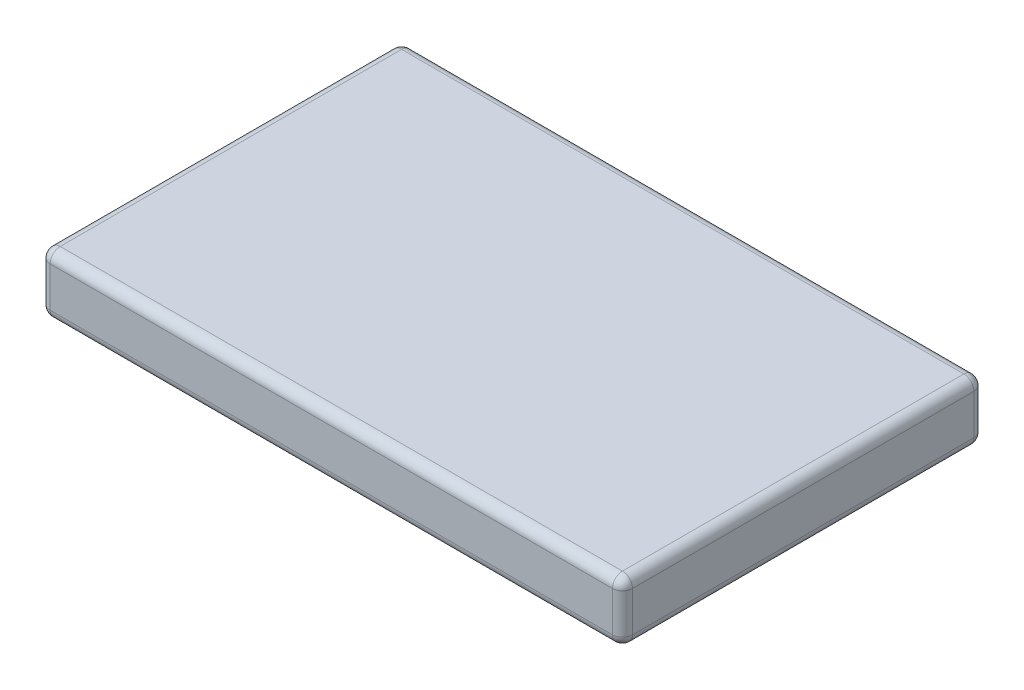
ISO-10303-21;
HEADER;
FILE_DESCRIPTION(('STEP AP214'),'2;1');
FILE_NAME('part.step','',(''),(''),'','','');
FILE_SCHEMA(('AUTOMOTIVE_DESIGN { 1 0 10303 214 1 1 1 1 }'));
ENDSEC;
DATA;
#1=APPLICATION_CONTEXT('core data for automotive mechanical design processes');
#2=APPLICATION_PROTOCOL_DEFINITION('international standard','automotive_design',2000,#1);
#3=PRODUCT_CONTEXT('',#1,'mechanical');
#4=PRODUCT('Part','Part','',(#3));
#5=PRODUCT_RELATED_PRODUCT_CATEGORY('part','',(#4));
#6=PRODUCT_DEFINITION_FORMATION('','',#4);
#7=PRODUCT_DEFINITION_CONTEXT('part definition',#1,'design');
#8=PRODUCT_DEFINITION('design','',#6,#7);
#9=PRODUCT_DEFINITION_SHAPE('','',#8);
#10=(LENGTH_UNIT() NAMED_UNIT(*) SI_UNIT(.MILLI.,.METRE.));
#11=(NAMED_UNIT(*) PLANE_ANGLE_UNIT() SI_UNIT($,.RADIAN.));
#12=(NAMED_UNIT(*) SI_UNIT($,.STERADIAN.) SOLID_ANGLE_UNIT());
#13=UNCERTAINTY_MEASURE_WITH_UNIT(LENGTH_MEASURE(1.E-05),#10,'distance_accuracy_value','');
#14=(GEOMETRIC_REPRESENTATION_CONTEXT(3) GLOBAL_UNCERTAINTY_ASSIGNED_CONTEXT((#13)) GLOBAL_UNIT_ASSIGNED_CONTEXT((#10,
#11,#12)) REPRESENTATION_CONTEXT('',''));
#15=CARTESIAN_POINT('',(0.,0.,0.));
#16=DIRECTION('',(0.,0.,1.));
#17=DIRECTION('',(1.,0.,0.));
#18=AXIS2_PLACEMENT_3D('',#15,#16,#17);
#19=CARTESIAN_POINT('',(-29.,6.,-18.));
#20=DIRECTION('',(1.,0.,0.));
#21=DIRECTION('',(0.,0.,-1.));
#22=AXIS2_PLACEMENT_3D('',#19,#20,#21);
#23=PLANE('',#22);
#24=DIRECTION('',(0.,0.,1.));
#25=VECTOR('',#24,1.);
#26=CARTESIAN_POINT('',(-29.,5.,-18.));
#27=LINE('',#26,#25);
#28=CARTESIAN_POINT('',(-29.,5.,17.));
#29=VERTEX_POINT('',#28);
#30=CARTESIAN_POINT('',(-29.,5.,-17.));
#31=VERTEX_POINT('',#30);
#32=EDGE_CURVE('E191',#29,#31,#27,.F.);
#33=ORIENTED_EDGE('',*,*,#32,.T.);
#34=DIRECTION('',(0.,-1.,0.));
#35=VECTOR('',#34,1.);
#36=CARTESIAN_POINT('',(-29.,6.,-17.));
#37=LINE('',#36,#35);
#38=CARTESIAN_POINT('',(-29.,1.,-17.));
#39=VERTEX_POINT('',#38);
#40=EDGE_CURVE('E196',#31,#39,#37,.T.);
#41=ORIENTED_EDGE('',*,*,#40,.T.);
#42=DIRECTION('',(0.,0.,1.));
#43=VECTOR('',#42,1.);
#44=CARTESIAN_POINT('',(-29.,1.,18.));
#45=LINE('',#44,#43);
#46=CARTESIAN_POINT('',(-29.,1.,17.));
#47=VERTEX_POINT('',#46);
#48=EDGE_CURVE('E193',#39,#47,#45,.T.);
#49=ORIENTED_EDGE('',*,*,#48,.T.);
#50=DIRECTION('',(0.,-1.,0.));
#51=VECTOR('',#50,1.);
#52=CARTESIAN_POINT('',(-29.,6.,17.));
#53=LINE('',#52,#51);
#54=EDGE_CURVE('E189',#47,#29,#53,.F.);
#55=ORIENTED_EDGE('',*,*,#54,.T.);
#56=EDGE_LOOP('',(#33,#41,#49,#55));
#57=FACE_BOUND('',#56,.T.);
#58=ADVANCED_FACE('F37',(#57),#23,.F.);
#59=CARTESIAN_POINT('',(29.,6.,18.));
#60=DIRECTION('',(0.,0.,-1.));
#61=DIRECTION('',(-1.,0.,0.));
#62=AXIS2_PLACEMENT_3D('',#59,#60,#61);
#63=PLANE('',#62);
#64=DIRECTION('',(1.,0.,0.));
#65=VECTOR('',#64,1.);
#66=CARTESIAN_POINT('',(29.,5.,18.));
#67=LINE('',#66,#65);
#68=CARTESIAN_POINT('',(28.,5.,18.));
#69=VERTEX_POINT('',#68);
#70=CARTESIAN_POINT('',(-28.,5.,18.));
#71=VERTEX_POINT('',#70);
#72=EDGE_CURVE('E154',#69,#71,#67,.F.);
#73=ORIENTED_EDGE('',*,*,#72,.T.);
#74=DIRECTION('',(0.,-1.,0.));
#75=VECTOR('',#74,1.);
#76=CARTESIAN_POINT('',(-28.,6.,18.));
#77=LINE('',#76,#75);
#78=CARTESIAN_POINT('',(-28.,1.,18.));
#79=VERTEX_POINT('',#78);
#80=EDGE_CURVE('E158',#71,#79,#77,.T.);
#81=ORIENTED_EDGE('',*,*,#80,.T.);
#82=DIRECTION('',(1.,0.,0.));
#83=VECTOR('',#82,1.);
#84=CARTESIAN_POINT('',(29.,1.,18.));
#85=LINE('',#84,#83);
#86=CARTESIAN_POINT('',(28.,1.,18.));
#87=VERTEX_POINT('',#86);
#88=EDGE_CURVE('E130',#79,#87,#85,.T.);
#89=ORIENTED_EDGE('',*,*,#88,.T.);
#90=DIRECTION('',(0.,-1.,0.));
#91=VECTOR('',#90,1.);
#92=CARTESIAN_POINT('',(28.,6.,18.));
#93=LINE('',#92,#91);
#94=EDGE_CURVE('E148',#87,#69,#93,.F.);
#95=ORIENTED_EDGE('',*,*,#94,.T.);
#96=EDGE_LOOP('',(#73,#81,#89,#95));
#97=FACE_BOUND('',#96,.T.);
#98=ADVANCED_FACE('F156',(#97),#63,.F.);
#99=CARTESIAN_POINT('',(29.,6.,-18.));
#100=DIRECTION('',(-1.,0.,0.));
#101=DIRECTION('',(0.,0.,1.));
#102=AXIS2_PLACEMENT_3D('',#99,#100,#101);
#103=PLANE('',#102);
#104=DIRECTION('',(0.,0.,-1.));
#105=VECTOR('',#104,1.);
#106=CARTESIAN_POINT('',(29.,1.,-18.));
#107=LINE('',#106,#105);
#108=CARTESIAN_POINT('',(29.,1.,17.));
#109=VERTEX_POINT('',#108);
#110=CARTESIAN_POINT('',(29.,1.,-17.));
#111=VERTEX_POINT('',#110);
#112=EDGE_CURVE('E175',#109,#111,#107,.T.);
#113=ORIENTED_EDGE('',*,*,#112,.T.);
#114=DIRECTION('',(0.,-1.,0.));
#115=VECTOR('',#114,1.);
#116=CARTESIAN_POINT('',(29.,6.,-17.));
#117=LINE('',#116,#115);
#118=CARTESIAN_POINT('',(29.,5.,-17.));
#119=VERTEX_POINT('',#118);
#120=EDGE_CURVE('E178',#111,#119,#117,.F.);
#121=ORIENTED_EDGE('',*,*,#120,.T.);
#122=DIRECTION('',(0.,0.,-1.));
#123=VECTOR('',#122,1.);
#124=CARTESIAN_POINT('',(29.,5.,-18.));
#125=LINE('',#124,#123);
#126=CARTESIAN_POINT('',(29.,5.,17.));
#127=VERTEX_POINT('',#126);
#128=EDGE_CURVE('E173',#119,#127,#125,.F.);
#129=ORIENTED_EDGE('',*,*,#128,.T.);
#130=DIRECTION('',(0.,-1.,0.));
#131=VECTOR('',#130,1.);
#132=CARTESIAN_POINT('',(29.,6.,17.));
#133=LINE('',#132,#131);
#134=EDGE_CURVE('E171',#127,#109,#133,.T.);
#135=ORIENTED_EDGE('',*,*,#134,.T.);
#136=EDGE_LOOP('',(#113,#121,#129,#135));
#137=FACE_BOUND('',#136,.T.);
#138=ADVANCED_FACE('F331',(#137),#103,.F.);
#139=CARTESIAN_POINT('',(29.,6.,-18.));
#140=DIRECTION('',(0.,0.,1.));
#141=DIRECTION('',(1.,0.,0.));
#142=AXIS2_PLACEMENT_3D('',#139,#140,#141);
#143=PLANE('',#142);
#144=DIRECTION('',(-1.,0.,0.));
#145=VECTOR('',#144,1.);
#146=CARTESIAN_POINT('',(-29.,1.,-18.));
#147=LINE('',#146,#145);
#148=CARTESIAN_POINT('',(28.,1.,-18.));
#149=VERTEX_POINT('',#148);
#150=CARTESIAN_POINT('',(-28.,1.,-18.));
#151=VERTEX_POINT('',#150);
#152=EDGE_CURVE('E184',#149,#151,#147,.T.);
#153=ORIENTED_EDGE('',*,*,#152,.T.);
#154=DIRECTION('',(0.,-1.,0.));
#155=VECTOR('',#154,1.);
#156=CARTESIAN_POINT('',(-28.,6.,-18.));
#157=LINE('',#156,#155);
#158=CARTESIAN_POINT('',(-28.,5.,-18.));
#159=VERTEX_POINT('',#158);
#160=EDGE_CURVE('E187',#151,#159,#157,.F.);
#161=ORIENTED_EDGE('',*,*,#160,.T.);
#162=DIRECTION('',(-1.,0.,0.));
#163=VECTOR('',#162,1.);
#164=CARTESIAN_POINT('',(29.,5.,-18.));
#165=LINE('',#164,#163);
#166=CARTESIAN_POINT('',(28.,5.,-18.));
#167=VERTEX_POINT('',#166);
#168=EDGE_CURVE('E182',#159,#167,#165,.F.);
#169=ORIENTED_EDGE('',*,*,#168,.T.);
#170=DIRECTION('',(0.,-1.,0.));
#171=VECTOR('',#170,1.);
#172=CARTESIAN_POINT('',(28.,6.,-18.));
#173=LINE('',#172,#171);
#174=EDGE_CURVE('E180',#167,#149,#173,.T.);
#175=ORIENTED_EDGE('',*,*,#174,.T.);
#176=EDGE_LOOP('',(#153,#161,#169,#175));
#177=FACE_BOUND('',#176,.T.);
#178=ADVANCED_FACE('F298',(#177),#143,.F.);
#179=CARTESIAN_POINT('',(0.,6.,0.));
#180=DIRECTION('',(0.,-1.,0.));
#181=DIRECTION('',(0.,0.,-1.));
#182=AXIS2_PLACEMENT_3D('',#179,#180,#181);
#183=PLANE('',#182);
#184=DIRECTION('',(0.,0.,-1.));
#185=VECTOR('',#184,1.);
#186=CARTESIAN_POINT('',(28.,6.,0.));
#187=LINE('',#186,#185);
#188=CARTESIAN_POINT('',(28.,6.,17.));
#189=VERTEX_POINT('',#188);
#190=CARTESIAN_POINT('',(28.,6.,-17.));
#191=VERTEX_POINT('',#190);
#192=EDGE_CURVE('E46',#189,#191,#187,.T.);
#193=ORIENTED_EDGE('',*,*,#192,.T.);
#194=DIRECTION('',(-1.,0.,0.));
#195=VECTOR('',#194,1.);
#196=CARTESIAN_POINT('',(0.,6.,-17.));
#197=LINE('',#196,#195);
#198=CARTESIAN_POINT('',(-28.,6.,-17.));
#199=VERTEX_POINT('',#198);
#200=EDGE_CURVE('E11',#191,#199,#197,.T.);
#201=ORIENTED_EDGE('',*,*,#200,.T.);
#202=DIRECTION('',(0.,0.,1.));
#203=VECTOR('',#202,1.);
#204=CARTESIAN_POINT('',(-28.,6.,0.));
#205=LINE('',#204,#203);
#206=CARTESIAN_POINT('',(-28.,6.,17.));
#207=VERTEX_POINT('',#206);
#208=EDGE_CURVE('E198',#199,#207,#205,.T.);
#209=ORIENTED_EDGE('',*,*,#208,.T.);
#210=DIRECTION('',(1.,0.,0.));
#211=VECTOR('',#210,1.);
#212=CARTESIAN_POINT('',(0.,6.,17.));
#213=LINE('',#212,#211);
#214=EDGE_CURVE('E57',#207,#189,#213,.T.);
#215=ORIENTED_EDGE('',*,*,#214,.T.);
#216=EDGE_LOOP('',(#193,#201,#209,#215));
#217=FACE_BOUND('',#216,.T.);
#218=ADVANCED_FACE('F278',(#217),#183,.F.);
#219=CARTESIAN_POINT('',(0.,0.,0.));
#220=DIRECTION('',(0.,-1.,0.));
#221=DIRECTION('',(0.,0.,-1.));
#222=AXIS2_PLACEMENT_3D('',#219,#220,#221);
#223=PLANE('',#222);
#224=DIRECTION('',(0.,0.,-1.));
#225=VECTOR('',#224,1.);
#226=CARTESIAN_POINT('',(28.,0.,18.));
#227=LINE('',#226,#225);
#228=CARTESIAN_POINT('',(28.,0.,-17.));
#229=VERTEX_POINT('',#228);
#230=CARTESIAN_POINT('',(28.,0.,17.));
#231=VERTEX_POINT('',#230);
#232=EDGE_CURVE('E168',#229,#231,#227,.F.);
#233=ORIENTED_EDGE('',*,*,#232,.T.);
#234=DIRECTION('',(1.,0.,0.));
#235=VECTOR('',#234,1.);
#236=CARTESIAN_POINT('',(-29.,0.,17.));
#237=LINE('',#236,#235);
#238=CARTESIAN_POINT('',(-28.,0.,17.));
#239=VERTEX_POINT('',#238);
#240=EDGE_CURVE('E132',#231,#239,#237,.F.);
#241=ORIENTED_EDGE('',*,*,#240,.T.);
#242=DIRECTION('',(0.,0.,1.));
#243=VECTOR('',#242,1.);
#244=CARTESIAN_POINT('',(-28.,0.,-18.));
#245=LINE('',#244,#243);
#246=CARTESIAN_POINT('',(-28.,0.,-17.));
#247=VERTEX_POINT('',#246);
#248=EDGE_CURVE('E161',#239,#247,#245,.F.);
#249=ORIENTED_EDGE('',*,*,#248,.T.);
#250=DIRECTION('',(-1.,0.,0.));
#251=VECTOR('',#250,1.);
#252=CARTESIAN_POINT('',(29.,0.,-17.));
#253=LINE('',#252,#251);
#254=EDGE_CURVE('E166',#247,#229,#253,.F.);
#255=ORIENTED_EDGE('',*,*,#254,.T.);
#256=EDGE_LOOP('',(#233,#241,#249,#255));
#257=FACE_BOUND('',#256,.T.);
#258=ADVANCED_FACE('F359',(#257),#223,.T.);
#259=CARTESIAN_POINT('',(0.,5.,-17.));
#260=DIRECTION('',(-1.,0.,0.));
#261=DIRECTION('',(0.,0.,1.));
#262=AXIS2_PLACEMENT_3D('',#259,#260,#261);
#263=CYLINDRICAL_SURFACE('',#262,1.);
#264=CARTESIAN_POINT('',(-28.,5.,-17.));
#265=DIRECTION('',(-1.,0.,0.));
#266=DIRECTION('',(0.,0.,1.));
#267=AXIS2_PLACEMENT_3D('',#264,#265,#266);
#268=CIRCLE('',#267,1.);
#269=EDGE_CURVE('E41',#199,#159,#268,.T.);
#270=ORIENTED_EDGE('',*,*,#269,.F.);
#271=ORIENTED_EDGE('',*,*,#200,.F.);
#272=CARTESIAN_POINT('',(28.,5.,-17.));
#273=DIRECTION('',(1.,0.,0.));
#274=DIRECTION('',(0.,0.,-1.));
#275=AXIS2_PLACEMENT_3D('',#272,#273,#274);
#276=CIRCLE('',#275,1.);
#277=EDGE_CURVE('E251',#167,#191,#276,.T.);
#278=ORIENTED_EDGE('',*,*,#277,.F.);
#279=ORIENTED_EDGE('',*,*,#168,.F.);
#280=EDGE_LOOP('',(#270,#271,#278,#279));
#281=FACE_BOUND('',#280,.T.);
#282=ADVANCED_FACE('F39',(#281),#263,.T.);
#283=CARTESIAN_POINT('',(-28.,5.,-17.));
#284=DIRECTION('',(0.,0.,-1.));
#285=DIRECTION('',(-1.,0.,0.));
#286=AXIS2_PLACEMENT_3D('',#283,#284,#285);
#287=SPHERICAL_SURFACE('',#286,1.);
#288=CARTESIAN_POINT('',(-28.,5.,-17.));
#289=DIRECTION('',(0.,0.,-1.));
#290=DIRECTION('',(0.,1.,0.));
#291=AXIS2_PLACEMENT_3D('',#288,#289,#290);
#292=CIRCLE('',#291,1.);
#293=EDGE_CURVE('E246',#199,#31,#292,.F.);
#294=ORIENTED_EDGE('',*,*,#293,.F.);
#295=ORIENTED_EDGE('',*,*,#269,.T.);
#296=CARTESIAN_POINT('',(-28.,5.,-17.));
#297=DIRECTION('',(0.,1.,0.));
#298=DIRECTION('',(0.,0.,1.));
#299=AXIS2_PLACEMENT_3D('',#296,#297,#298);
#300=CIRCLE('',#299,1.);
#301=EDGE_CURVE('E249',#31,#159,#300,.F.);
#302=ORIENTED_EDGE('',*,*,#301,.F.);
#303=EDGE_LOOP('',(#294,#295,#302));
#304=FACE_BOUND('',#303,.T.);
#305=ADVANCED_FACE('F262',(#304),#287,.T.);
#306=CARTESIAN_POINT('',(28.,5.,-17.));
#307=DIRECTION('',(0.,1.,0.));
#308=DIRECTION('',(0.,0.,1.));
#309=AXIS2_PLACEMENT_3D('',#306,#307,#308);
#310=SPHERICAL_SURFACE('',#309,1.);
#311=CARTESIAN_POINT('',(28.,5.,-17.));
#312=DIRECTION('',(0.,1.,0.));
#313=DIRECTION('',(0.,0.,1.));
#314=AXIS2_PLACEMENT_3D('',#311,#312,#313);
#315=CIRCLE('',#314,1.);
#316=EDGE_CURVE('E240',#167,#119,#315,.F.);
#317=ORIENTED_EDGE('',*,*,#316,.F.);
#318=ORIENTED_EDGE('',*,*,#277,.T.);
#319=CARTESIAN_POINT('',(28.,5.,-17.));
#320=DIRECTION('',(0.,0.,-1.));
#321=DIRECTION('',(-1.,0.,0.));
#322=AXIS2_PLACEMENT_3D('',#319,#320,#321);
#323=CIRCLE('',#322,1.);
#324=EDGE_CURVE('E243',#119,#191,#323,.F.);
#325=ORIENTED_EDGE('',*,*,#324,.F.);
#326=EDGE_LOOP('',(#317,#318,#325));
#327=FACE_BOUND('',#326,.T.);
#328=ADVANCED_FACE('F290',(#327),#310,.T.);
#329=CARTESIAN_POINT('',(-28.,6.,-17.));
#330=DIRECTION('',(0.,-1.,0.));
#331=DIRECTION('',(0.,0.,-1.));
#332=AXIS2_PLACEMENT_3D('',#329,#330,#331);
#333=CYLINDRICAL_SURFACE('',#332,1.);
#334=ORIENTED_EDGE('',*,*,#301,.T.);
#335=ORIENTED_EDGE('',*,*,#160,.F.);
#336=CARTESIAN_POINT('',(-28.,1.,-17.));
#337=DIRECTION('',(0.,-1.,0.));
#338=DIRECTION('',(0.,0.,-1.));
#339=AXIS2_PLACEMENT_3D('',#336,#337,#338);
#340=CIRCLE('',#339,1.);
#341=EDGE_CURVE('E235',#39,#151,#340,.T.);
#342=ORIENTED_EDGE('',*,*,#341,.F.);
#343=ORIENTED_EDGE('',*,*,#40,.F.);
#344=EDGE_LOOP('',(#334,#335,#342,#343));
#345=FACE_BOUND('',#344,.T.);
#346=ADVANCED_FACE('F268',(#345),#333,.T.);
#347=CARTESIAN_POINT('',(-28.,5.,0.));
#348=DIRECTION('',(0.,0.,1.));
#349=DIRECTION('',(1.,0.,0.));
#350=AXIS2_PLACEMENT_3D('',#347,#348,#349);
#351=CYLINDRICAL_SURFACE('',#350,1.);
#352=ORIENTED_EDGE('',*,*,#293,.T.);
#353=ORIENTED_EDGE('',*,*,#32,.F.);
#354=CARTESIAN_POINT('',(-28.,5.,17.));
#355=DIRECTION('',(0.,0.,1.));
#356=DIRECTION('',(1.,0.,0.));
#357=AXIS2_PLACEMENT_3D('',#354,#355,#356);
#358=CIRCLE('',#357,1.);
#359=EDGE_CURVE('E232',#207,#29,#358,.T.);
#360=ORIENTED_EDGE('',*,*,#359,.F.);
#361=ORIENTED_EDGE('',*,*,#208,.F.);
#362=EDGE_LOOP('',(#352,#353,#360,#361));
#363=FACE_BOUND('',#362,.T.);
#364=ADVANCED_FACE('F277',(#363),#351,.T.);
#365=CARTESIAN_POINT('',(0.,5.,17.));
#366=DIRECTION('',(1.,0.,0.));
#367=DIRECTION('',(0.,0.,-1.));
#368=AXIS2_PLACEMENT_3D('',#365,#366,#367);
#369=CYLINDRICAL_SURFACE('',#368,1.);
#370=CARTESIAN_POINT('',(28.,5.,17.));
#371=DIRECTION('',(1.,0.,0.));
#372=DIRECTION('',(0.,0.,-1.));
#373=AXIS2_PLACEMENT_3D('',#370,#371,#372);
#374=CIRCLE('',#373,1.);
#375=EDGE_CURVE('E226',#189,#69,#374,.T.);
#376=ORIENTED_EDGE('',*,*,#375,.F.);
#377=ORIENTED_EDGE('',*,*,#214,.F.);
#378=CARTESIAN_POINT('',(-28.,5.,17.));
#379=DIRECTION('',(-1.,0.,0.));
#380=DIRECTION('',(0.,0.,1.));
#381=AXIS2_PLACEMENT_3D('',#378,#379,#380);
#382=CIRCLE('',#381,1.);
#383=EDGE_CURVE('E229',#71,#207,#382,.T.);
#384=ORIENTED_EDGE('',*,*,#383,.F.);
#385=ORIENTED_EDGE('',*,*,#72,.F.);
#386=EDGE_LOOP('',(#376,#377,#384,#385));
#387=FACE_BOUND('',#386,.T.);
#388=ADVANCED_FACE('F282',(#387),#369,.T.);
#389=CARTESIAN_POINT('',(28.,5.,0.));
#390=DIRECTION('',(0.,0.,-1.));
#391=DIRECTION('',(-1.,0.,0.));
#392=AXIS2_PLACEMENT_3D('',#389,#390,#391);
#393=CYLINDRICAL_SURFACE('',#392,1.);
#394=ORIENTED_EDGE('',*,*,#324,.T.);
#395=ORIENTED_EDGE('',*,*,#192,.F.);
#396=CARTESIAN_POINT('',(28.,5.,17.));
#397=DIRECTION('',(0.,0.,1.));
#398=DIRECTION('',(1.,0.,0.));
#399=AXIS2_PLACEMENT_3D('',#396,#397,#398);
#400=CIRCLE('',#399,1.);
#401=EDGE_CURVE('E223',#127,#189,#400,.T.);
#402=ORIENTED_EDGE('',*,*,#401,.F.);
#403=ORIENTED_EDGE('',*,*,#128,.F.);
#404=EDGE_LOOP('',(#394,#395,#402,#403));
#405=FACE_BOUND('',#404,.T.);
#406=ADVANCED_FACE('F289',(#405),#393,.T.);
#407=CARTESIAN_POINT('',(28.,6.,-17.));
#408=DIRECTION('',(0.,-1.,0.));
#409=DIRECTION('',(0.,0.,-1.));
#410=AXIS2_PLACEMENT_3D('',#407,#408,#409);
#411=CYLINDRICAL_SURFACE('',#410,1.);
#412=ORIENTED_EDGE('',*,*,#316,.T.);
#413=ORIENTED_EDGE('',*,*,#120,.F.);
#414=CARTESIAN_POINT('',(28.,1.,-17.));
#415=DIRECTION('',(0.,-1.,0.));
#416=DIRECTION('',(0.,0.,-1.));
#417=AXIS2_PLACEMENT_3D('',#414,#415,#416);
#418=CIRCLE('',#417,1.);
#419=EDGE_CURVE('E220',#149,#111,#418,.T.);
#420=ORIENTED_EDGE('',*,*,#419,.F.);
#421=ORIENTED_EDGE('',*,*,#174,.F.);
#422=EDGE_LOOP('',(#412,#413,#420,#421));
#423=FACE_BOUND('',#422,.T.);
#424=ADVANCED_FACE('F295',(#423),#411,.T.);
#425=CARTESIAN_POINT('',(29.,1.,-17.));
#426=DIRECTION('',(1.,0.,0.));
#427=DIRECTION('',(0.,0.,-1.));
#428=AXIS2_PLACEMENT_3D('',#425,#426,#427);
#429=CYLINDRICAL_SURFACE('',#428,1.);
#430=CARTESIAN_POINT('',(-28.,1.,-17.));
#431=DIRECTION('',(-1.,0.,0.));
#432=DIRECTION('',(0.,0.,1.));
#433=AXIS2_PLACEMENT_3D('',#430,#431,#432);
#434=CIRCLE('',#433,1.);
#435=EDGE_CURVE('E237',#151,#247,#434,.T.);
#436=ORIENTED_EDGE('',*,*,#435,.F.);
#437=ORIENTED_EDGE('',*,*,#152,.F.);
#438=CARTESIAN_POINT('',(28.,1.,-17.));
#439=DIRECTION('',(1.,0.,0.));
#440=DIRECTION('',(0.,0.,-1.));
#441=AXIS2_PLACEMENT_3D('',#438,#439,#440);
#442=CIRCLE('',#441,1.);
#443=EDGE_CURVE('E217',#229,#149,#442,.T.);
#444=ORIENTED_EDGE('',*,*,#443,.F.);
#445=ORIENTED_EDGE('',*,*,#254,.F.);
#446=EDGE_LOOP('',(#436,#437,#444,#445));
#447=FACE_BOUND('',#446,.T.);
#448=ADVANCED_FACE('F302',(#447),#429,.T.);
#449=CARTESIAN_POINT('',(-28.,1.,-17.));
#450=DIRECTION('',(0.,0.,-1.));
#451=DIRECTION('',(-1.,0.,0.));
#452=AXIS2_PLACEMENT_3D('',#449,#450,#451);
#453=SPHERICAL_SURFACE('',#452,1.);
#454=ORIENTED_EDGE('',*,*,#341,.T.);
#455=ORIENTED_EDGE('',*,*,#435,.T.);
#456=CARTESIAN_POINT('',(-28.,1.,-17.));
#457=DIRECTION('',(0.,0.,-1.));
#458=DIRECTION('',(-1.,0.,0.));
#459=AXIS2_PLACEMENT_3D('',#456,#457,#458);
#460=CIRCLE('',#459,1.);
#461=EDGE_CURVE('E214',#39,#247,#460,.F.);
#462=ORIENTED_EDGE('',*,*,#461,.F.);
#463=EDGE_LOOP('',(#454,#455,#462));
#464=FACE_BOUND('',#463,.T.);
#465=ADVANCED_FACE('F306',(#464),#453,.T.);
#466=CARTESIAN_POINT('',(-28.,5.,17.));
#467=DIRECTION('',(0.,1.,0.));
#468=DIRECTION('',(0.,0.,1.));
#469=AXIS2_PLACEMENT_3D('',#466,#467,#468);
#470=SPHERICAL_SURFACE('',#469,1.);
#471=ORIENTED_EDGE('',*,*,#383,.T.);
#472=ORIENTED_EDGE('',*,*,#359,.T.);
#473=CARTESIAN_POINT('',(-28.,5.,17.));
#474=DIRECTION('',(0.,1.,0.));
#475=DIRECTION('',(0.,0.,1.));
#476=AXIS2_PLACEMENT_3D('',#473,#474,#475);
#477=CIRCLE('',#476,1.);
#478=EDGE_CURVE('E211',#71,#29,#477,.F.);
#479=ORIENTED_EDGE('',*,*,#478,.F.);
#480=EDGE_LOOP('',(#471,#472,#479));
#481=FACE_BOUND('',#480,.T.);
#482=ADVANCED_FACE('F316',(#481),#470,.T.);
#483=CARTESIAN_POINT('',(28.,5.,17.));
#484=DIRECTION('',(0.,1.,0.));
#485=DIRECTION('',(0.,0.,1.));
#486=AXIS2_PLACEMENT_3D('',#483,#484,#485);
#487=SPHERICAL_SURFACE('',#486,1.);
#488=ORIENTED_EDGE('',*,*,#401,.T.);
#489=ORIENTED_EDGE('',*,*,#375,.T.);
#490=CARTESIAN_POINT('',(28.,5.,17.));
#491=DIRECTION('',(0.,1.,0.));
#492=DIRECTION('',(0.,0.,1.));
#493=AXIS2_PLACEMENT_3D('',#490,#491,#492);
#494=CIRCLE('',#493,1.);
#495=EDGE_CURVE('E151',#127,#69,#494,.F.);
#496=ORIENTED_EDGE('',*,*,#495,.F.);
#497=EDGE_LOOP('',(#488,#489,#496));
#498=FACE_BOUND('',#497,.T.);
#499=ADVANCED_FACE('F286',(#498),#487,.T.);
#500=CARTESIAN_POINT('',(28.,1.,-17.));
#501=DIRECTION('',(0.,0.,-1.));
#502=DIRECTION('',(-1.,0.,0.));
#503=AXIS2_PLACEMENT_3D('',#500,#501,#502);
#504=SPHERICAL_SURFACE('',#503,1.);
#505=ORIENTED_EDGE('',*,*,#443,.T.);
#506=ORIENTED_EDGE('',*,*,#419,.T.);
#507=CARTESIAN_POINT('',(28.,1.,-17.));
#508=DIRECTION('',(0.,0.,-1.));
#509=DIRECTION('',(-1.,0.,0.));
#510=AXIS2_PLACEMENT_3D('',#507,#508,#509);
#511=CIRCLE('',#510,1.);
#512=EDGE_CURVE('E208',#229,#111,#511,.F.);
#513=ORIENTED_EDGE('',*,*,#512,.F.);
#514=EDGE_LOOP('',(#505,#506,#513));
#515=FACE_BOUND('',#514,.T.);
#516=ADVANCED_FACE('F323',(#515),#504,.T.);
#517=CARTESIAN_POINT('',(-28.,1.,-18.));
#518=DIRECTION('',(0.,0.,-1.));
#519=DIRECTION('',(-1.,0.,0.));
#520=AXIS2_PLACEMENT_3D('',#517,#518,#519);
#521=CYLINDRICAL_SURFACE('',#520,1.);
#522=ORIENTED_EDGE('',*,*,#461,.T.);
#523=ORIENTED_EDGE('',*,*,#248,.F.);
#524=CARTESIAN_POINT('',(-28.,1.,17.));
#525=DIRECTION('',(0.,0.,1.));
#526=DIRECTION('',(1.,0.,0.));
#527=AXIS2_PLACEMENT_3D('',#524,#525,#526);
#528=CIRCLE('',#527,1.);
#529=EDGE_CURVE('E205',#47,#239,#528,.T.);
#530=ORIENTED_EDGE('',*,*,#529,.F.);
#531=ORIENTED_EDGE('',*,*,#48,.F.);
#532=EDGE_LOOP('',(#522,#523,#530,#531));
#533=FACE_BOUND('',#532,.T.);
#534=ADVANCED_FACE('F309',(#533),#521,.T.);
#535=CARTESIAN_POINT('',(-28.,6.,17.));
#536=DIRECTION('',(0.,-1.,0.));
#537=DIRECTION('',(0.,0.,-1.));
#538=AXIS2_PLACEMENT_3D('',#535,#536,#537);
#539=CYLINDRICAL_SURFACE('',#538,1.);
#540=ORIENTED_EDGE('',*,*,#478,.T.);
#541=ORIENTED_EDGE('',*,*,#54,.F.);
#542=CARTESIAN_POINT('',(-28.,1.,17.));
#543=DIRECTION('',(0.,-1.,0.));
#544=DIRECTION('',(0.,0.,-1.));
#545=AXIS2_PLACEMENT_3D('',#542,#543,#544);
#546=CIRCLE('',#545,1.);
#547=EDGE_CURVE('E145',#79,#47,#546,.T.);
#548=ORIENTED_EDGE('',*,*,#547,.F.);
#549=ORIENTED_EDGE('',*,*,#80,.F.);
#550=EDGE_LOOP('',(#540,#541,#548,#549));
#551=FACE_BOUND('',#550,.T.);
#552=ADVANCED_FACE('F314',(#551),#539,.T.);
#553=CARTESIAN_POINT('',(28.,6.,17.));
#554=DIRECTION('',(0.,-1.,0.));
#555=DIRECTION('',(0.,0.,-1.));
#556=AXIS2_PLACEMENT_3D('',#553,#554,#555);
#557=CYLINDRICAL_SURFACE('',#556,1.);
#558=ORIENTED_EDGE('',*,*,#495,.T.);
#559=ORIENTED_EDGE('',*,*,#94,.F.);
#560=CARTESIAN_POINT('',(28.,1.,17.));
#561=DIRECTION('',(0.,-1.,0.));
#562=DIRECTION('',(0.,0.,-1.));
#563=AXIS2_PLACEMENT_3D('',#560,#561,#562);
#564=CIRCLE('',#563,1.);
#565=EDGE_CURVE('E138',#109,#87,#564,.T.);
#566=ORIENTED_EDGE('',*,*,#565,.F.);
#567=ORIENTED_EDGE('',*,*,#134,.F.);
#568=EDGE_LOOP('',(#558,#559,#566,#567));
#569=FACE_BOUND('',#568,.T.);
#570=ADVANCED_FACE('F149',(#569),#557,.T.);
#571=CARTESIAN_POINT('',(28.,1.,-18.));
#572=DIRECTION('',(0.,0.,1.));
#573=DIRECTION('',(1.,0.,0.));
#574=AXIS2_PLACEMENT_3D('',#571,#572,#573);
#575=CYLINDRICAL_SURFACE('',#574,1.);
#576=ORIENTED_EDGE('',*,*,#512,.T.);
#577=ORIENTED_EDGE('',*,*,#112,.F.);
#578=CARTESIAN_POINT('',(28.,1.,17.));
#579=DIRECTION('',(0.,0.,1.));
#580=DIRECTION('',(1.,0.,0.));
#581=AXIS2_PLACEMENT_3D('',#578,#579,#580);
#582=CIRCLE('',#581,1.);
#583=EDGE_CURVE('E142',#231,#109,#582,.T.);
#584=ORIENTED_EDGE('',*,*,#583,.F.);
#585=ORIENTED_EDGE('',*,*,#232,.F.);
#586=EDGE_LOOP('',(#576,#577,#584,#585));
#587=FACE_BOUND('',#586,.T.);
#588=ADVANCED_FACE('F342',(#587),#575,.T.);
#589=CARTESIAN_POINT('',(-28.,1.,17.));
#590=DIRECTION('',(-1.,0.,0.));
#591=DIRECTION('',(0.,0.,1.));
#592=AXIS2_PLACEMENT_3D('',#589,#590,#591);
#593=SPHERICAL_SURFACE('',#592,1.);
#594=ORIENTED_EDGE('',*,*,#547,.T.);
#595=ORIENTED_EDGE('',*,*,#529,.T.);
#596=CARTESIAN_POINT('',(-28.,1.,17.));
#597=DIRECTION('',(-1.,0.,0.));
#598=DIRECTION('',(0.,0.,1.));
#599=AXIS2_PLACEMENT_3D('',#596,#597,#598);
#600=CIRCLE('',#599,1.);
#601=EDGE_CURVE('E135',#79,#239,#600,.F.);
#602=ORIENTED_EDGE('',*,*,#601,.F.);
#603=EDGE_LOOP('',(#594,#595,#602));
#604=FACE_BOUND('',#603,.T.);
#605=ADVANCED_FACE('F339',(#604),#593,.T.);
#606=CARTESIAN_POINT('',(28.,1.,17.));
#607=DIRECTION('',(1.,0.,0.));
#608=DIRECTION('',(0.,0.,-1.));
#609=AXIS2_PLACEMENT_3D('',#606,#607,#608);
#610=SPHERICAL_SURFACE('',#609,1.);
#611=ORIENTED_EDGE('',*,*,#583,.T.);
#612=ORIENTED_EDGE('',*,*,#565,.T.);
#613=CARTESIAN_POINT('',(28.,1.,17.));
#614=DIRECTION('',(1.,0.,0.));
#615=DIRECTION('',(0.,0.,-1.));
#616=AXIS2_PLACEMENT_3D('',#613,#614,#615);
#617=CIRCLE('',#616,1.);
#618=EDGE_CURVE('E126',#231,#87,#617,.F.);
#619=ORIENTED_EDGE('',*,*,#618,.F.);
#620=EDGE_LOOP('',(#611,#612,#619));
#621=FACE_BOUND('',#620,.T.);
#622=ADVANCED_FACE('F140',(#621),#610,.T.);
#623=CARTESIAN_POINT('',(29.,1.,17.));
#624=DIRECTION('',(-1.,0.,0.));
#625=DIRECTION('',(0.,0.,1.));
#626=AXIS2_PLACEMENT_3D('',#623,#624,#625);
#627=CYLINDRICAL_SURFACE('',#626,1.);
#628=ORIENTED_EDGE('',*,*,#601,.T.);
#629=ORIENTED_EDGE('',*,*,#240,.F.);
#630=ORIENTED_EDGE('',*,*,#618,.T.);
#631=ORIENTED_EDGE('',*,*,#88,.F.);
#632=EDGE_LOOP('',(#628,#629,#630,#631));
#633=FACE_BOUND('',#632,.T.);
#634=ADVANCED_FACE('F128',(#633),#627,.T.);
#635=CLOSED_SHELL('',(#58,#98,#138,#178,#218,#258,#282,#305,#328,#346,#364,#388,#406,#424,#448,
#465,#482,#499,#516,#534,#552,#570,#588,#605,#622,#634));
#636=MANIFOLD_SOLID_BREP('B2',#635);
#637=ADVANCED_BREP_SHAPE_REPRESENTATION('',(#18,#636),#14);
#638=SHAPE_DEFINITION_REPRESENTATION(#9,#637);
ENDSEC;
END-ISO-10303-21;
